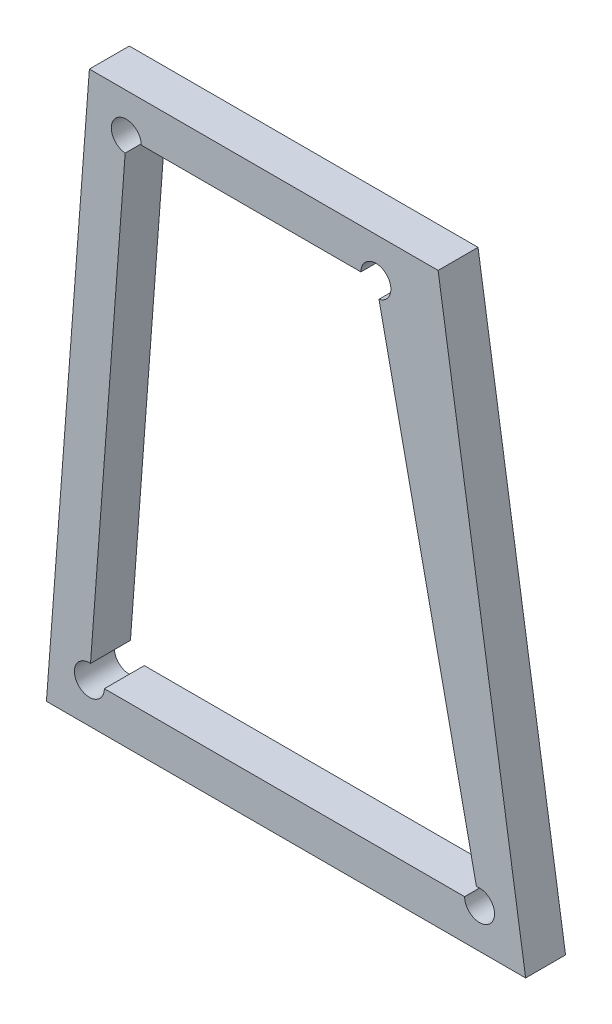
ISO-10303-21;
HEADER;
FILE_DESCRIPTION(('STEP AP214'),'2;1');
FILE_NAME('part.step','',(''),(''),'','','');
FILE_SCHEMA(('AUTOMOTIVE_DESIGN { 1 0 10303 214 1 1 1 1 }'));
ENDSEC;
DATA;
#1=APPLICATION_CONTEXT('core data for automotive mechanical design processes');
#2=APPLICATION_PROTOCOL_DEFINITION('international standard','automotive_design',2000,#1);
#3=PRODUCT_CONTEXT('',#1,'mechanical');
#4=PRODUCT('Part','Part','',(#3));
#5=PRODUCT_RELATED_PRODUCT_CATEGORY('part','',(#4));
#6=PRODUCT_DEFINITION_FORMATION('','',#4);
#7=PRODUCT_DEFINITION_CONTEXT('part definition',#1,'design');
#8=PRODUCT_DEFINITION('design','',#6,#7);
#9=PRODUCT_DEFINITION_SHAPE('','',#8);
#10=(LENGTH_UNIT() NAMED_UNIT(*) SI_UNIT(.MILLI.,.METRE.));
#11=(NAMED_UNIT(*) PLANE_ANGLE_UNIT() SI_UNIT($,.RADIAN.));
#12=(NAMED_UNIT(*) SI_UNIT($,.STERADIAN.) SOLID_ANGLE_UNIT());
#13=UNCERTAINTY_MEASURE_WITH_UNIT(LENGTH_MEASURE(1.E-05),#10,'distance_accuracy_value','');
#14=(GEOMETRIC_REPRESENTATION_CONTEXT(3) GLOBAL_UNCERTAINTY_ASSIGNED_CONTEXT((#13)) GLOBAL_UNIT_ASSIGNED_CONTEXT((#10,
#11,#12)) REPRESENTATION_CONTEXT('',''));
#15=CARTESIAN_POINT('',(0.,0.,0.));
#16=DIRECTION('',(0.,0.,1.));
#17=DIRECTION('',(1.,0.,0.));
#18=AXIS2_PLACEMENT_3D('',#15,#16,#17);
#19=CARTESIAN_POINT('',(0.,0.,4.));
#20=DIRECTION('',(0.,0.,1.));
#21=DIRECTION('',(1.,0.,0.));
#22=AXIS2_PLACEMENT_3D('',#19,#20,#21);
#23=PLANE('',#22);
#24=DIRECTION('',(-0.0752576694706878,-0.997164120486613,0.));
#25=VECTOR('',#24,1.);
#26=CARTESIAN_POINT('',(4.30188679245283,57.,4.));
#27=LINE('',#26,#25);
#28=CARTESIAN_POINT('',(4.30188679245283,57.,4.));
#29=VERTEX_POINT('',#28);
#30=CARTESIAN_POINT('',(0.,0.,4.));
#31=VERTEX_POINT('',#30);
#32=EDGE_CURVE('E189',#29,#31,#27,.T.);
#33=ORIENTED_EDGE('',*,*,#32,.T.);
#34=DIRECTION('',(1.,0.,0.));
#35=VECTOR('',#34,1.);
#36=CARTESIAN_POINT('',(0.,0.,4.));
#37=LINE('',#36,#35);
#38=CARTESIAN_POINT('',(48.,0.,4.));
#39=VERTEX_POINT('',#38);
#40=EDGE_CURVE('E192',#31,#39,#37,.T.);
#41=ORIENTED_EDGE('',*,*,#40,.T.);
#42=DIRECTION('',(-0.152038253867952,0.988374609832114,0.));
#43=VECTOR('',#42,1.);
#44=CARTESIAN_POINT('',(39.2318867924528,57.,4.));
#45=LINE('',#44,#43);
#46=CARTESIAN_POINT('',(39.2318867924528,57.,4.));
#47=VERTEX_POINT('',#46);
#48=EDGE_CURVE('E195',#39,#47,#45,.T.);
#49=ORIENTED_EDGE('',*,*,#48,.T.);
#50=DIRECTION('',(-1.,0.,0.));
#51=VECTOR('',#50,1.);
#52=CARTESIAN_POINT('',(4.30188679245283,57.,4.));
#53=LINE('',#52,#51);
#54=EDGE_CURVE('E197',#47,#29,#53,.T.);
#55=ORIENTED_EDGE('',*,*,#54,.T.);
#56=EDGE_LOOP('',(#33,#41,#49,#55));
#57=FACE_BOUND('',#56,.T.);
#58=DIRECTION('',(1.,0.,0.));
#59=VECTOR('',#58,1.);
#60=CARTESIAN_POINT('',(41.8846938099967,3.99999999999999,4.));
#61=LINE('',#60,#59);
#62=CARTESIAN_POINT('',(5.80188679245283,3.99999999999999,4.));
#63=VERTEX_POINT('',#62);
#64=CARTESIAN_POINT('',(41.8846938099967,3.99999999999999,4.));
#65=VERTEX_POINT('',#64);
#66=EDGE_CURVE('E132',#63,#65,#61,.T.);
#67=ORIENTED_EDGE('',*,*,#66,.F.);
#68=CARTESIAN_POINT('',(4.30188679245283,3.99999999999999,4.));
#69=DIRECTION('',(0.,0.,1.));
#70=DIRECTION('',(1.,0.,0.));
#71=AXIS2_PLACEMENT_3D('',#68,#69,#70);
#72=CIRCLE('',#71,1.5);
#73=CARTESIAN_POINT('',(4.41477329665886,5.49574618072992,4.));
#74=VERTEX_POINT('',#73);
#75=EDGE_CURVE('E124',#74,#63,#72,.T.);
#76=ORIENTED_EDGE('',*,*,#75,.F.);
#77=DIRECTION('',(-0.0752576694706878,-0.997164120486613,0.));
#78=VECTOR('',#77,1.);
#79=CARTESIAN_POINT('',(4.41477329665886,5.49574618072992,4.));
#80=LINE('',#79,#78);
#81=CARTESIAN_POINT('',(7.88711349579397,51.5042538192701,4.));
#82=VERTEX_POINT('',#81);
#83=EDGE_CURVE('E157',#82,#74,#80,.T.);
#84=ORIENTED_EDGE('',*,*,#83,.F.);
#85=CARTESIAN_POINT('',(8.,53.,4.));
#86=DIRECTION('',(0.,0.,1.));
#87=DIRECTION('',(1.,0.,0.));
#88=AXIS2_PLACEMENT_3D('',#85,#86,#87);
#89=CIRCLE('',#88,1.5);
#90=CARTESIAN_POINT('',(9.5,53.,4.));
#91=VERTEX_POINT('',#90);
#92=EDGE_CURVE('E155',#91,#82,#89,.T.);
#93=ORIENTED_EDGE('',*,*,#92,.F.);
#94=DIRECTION('',(-1.,0.,0.));
#95=VECTOR('',#94,1.);
#96=CARTESIAN_POINT('',(9.5,53.,4.));
#97=LINE('',#96,#95);
#98=CARTESIAN_POINT('',(31.5,53.,4.));
#99=VERTEX_POINT('',#98);
#100=EDGE_CURVE('E153',#99,#91,#97,.T.);
#101=ORIENTED_EDGE('',*,*,#100,.F.);
#102=CARTESIAN_POINT('',(33.,53.,4.));
#103=DIRECTION('',(0.,0.,1.));
#104=DIRECTION('',(1.,0.,0.));
#105=AXIS2_PLACEMENT_3D('',#102,#103,#104);
#106=CIRCLE('',#105,1.5);
#107=CARTESIAN_POINT('',(33.3109913509581,51.5325926333736,4.));
#108=VERTEX_POINT('',#107);
#109=EDGE_CURVE('E151',#108,#99,#106,.T.);
#110=ORIENTED_EDGE('',*,*,#109,.F.);
#111=DIRECTION('',(-0.207327567305416,0.978271577750891,0.));
#112=VECTOR('',#111,1.);
#113=CARTESIAN_POINT('',(43.0737024590386,5.46740736662634,4.));
#114=LINE('',#113,#112);
#115=CARTESIAN_POINT('',(43.0737024590386,5.46740736662634,4.));
#116=VERTEX_POINT('',#115);
#117=EDGE_CURVE('E147',#116,#108,#114,.T.);
#118=ORIENTED_EDGE('',*,*,#117,.F.);
#119=CARTESIAN_POINT('',(43.3846938099967,3.99999999999999,4.));
#120=DIRECTION('',(0.,0.,1.));
#121=DIRECTION('',(1.,0.,0.));
#122=AXIS2_PLACEMENT_3D('',#119,#120,#121);
#123=CIRCLE('',#122,1.5);
#124=EDGE_CURVE('E145',#65,#116,#123,.T.);
#125=ORIENTED_EDGE('',*,*,#124,.F.);
#126=EDGE_LOOP('',(#67,#76,#84,#93,#101,#110,#118,#125));
#127=FACE_BOUND('',#126,.T.);
#128=ADVANCED_FACE('F35',(#57,#127),#23,.T.);
#129=CARTESIAN_POINT('',(0.,0.,0.));
#130=DIRECTION('',(0.,0.,1.));
#131=DIRECTION('',(1.,0.,0.));
#132=AXIS2_PLACEMENT_3D('',#129,#130,#131);
#133=PLANE('',#132);
#134=DIRECTION('',(-0.0752576694706878,-0.997164120486613,0.));
#135=VECTOR('',#134,1.);
#136=CARTESIAN_POINT('',(4.30188679245283,57.,0.));
#137=LINE('',#136,#135);
#138=CARTESIAN_POINT('',(4.30188679245283,57.,0.));
#139=VERTEX_POINT('',#138);
#140=CARTESIAN_POINT('',(0.,0.,0.));
#141=VERTEX_POINT('',#140);
#142=EDGE_CURVE('E140',#139,#141,#137,.T.);
#143=ORIENTED_EDGE('',*,*,#142,.F.);
#144=DIRECTION('',(-1.,0.,0.));
#145=VECTOR('',#144,1.);
#146=CARTESIAN_POINT('',(4.30188679245283,57.,0.));
#147=LINE('',#146,#145);
#148=CARTESIAN_POINT('',(39.2318867924528,57.,0.));
#149=VERTEX_POINT('',#148);
#150=EDGE_CURVE('E193',#149,#139,#147,.T.);
#151=ORIENTED_EDGE('',*,*,#150,.F.);
#152=DIRECTION('',(-0.152038253867952,0.988374609832114,0.));
#153=VECTOR('',#152,1.);
#154=CARTESIAN_POINT('',(39.2318867924528,57.,0.));
#155=LINE('',#154,#153);
#156=CARTESIAN_POINT('',(48.,0.,0.));
#157=VERTEX_POINT('',#156);
#158=EDGE_CURVE('E204',#157,#149,#155,.T.);
#159=ORIENTED_EDGE('',*,*,#158,.F.);
#160=DIRECTION('',(1.,0.,0.));
#161=VECTOR('',#160,1.);
#162=CARTESIAN_POINT('',(0.,0.,0.));
#163=LINE('',#162,#161);
#164=EDGE_CURVE('E202',#141,#157,#163,.T.);
#165=ORIENTED_EDGE('',*,*,#164,.F.);
#166=EDGE_LOOP('',(#143,#151,#159,#165));
#167=FACE_BOUND('',#166,.T.);
#168=CARTESIAN_POINT('',(4.30188679245283,3.99999999999999,0.));
#169=DIRECTION('',(0.,0.,1.));
#170=DIRECTION('',(1.,0.,0.));
#171=AXIS2_PLACEMENT_3D('',#168,#169,#170);
#172=CIRCLE('',#171,1.5);
#173=CARTESIAN_POINT('',(4.41477329665886,5.49574618072992,0.));
#174=VERTEX_POINT('',#173);
#175=CARTESIAN_POINT('',(5.80188679245283,3.99999999999999,0.));
#176=VERTEX_POINT('',#175);
#177=EDGE_CURVE('E58',#174,#176,#172,.T.);
#178=ORIENTED_EDGE('',*,*,#177,.T.);
#179=DIRECTION('',(1.,0.,0.));
#180=VECTOR('',#179,1.);
#181=CARTESIAN_POINT('',(41.8846938099967,3.99999999999999,0.));
#182=LINE('',#181,#180);
#183=CARTESIAN_POINT('',(41.8846938099967,3.99999999999999,0.));
#184=VERTEX_POINT('',#183);
#185=EDGE_CURVE('E139',#176,#184,#182,.T.);
#186=ORIENTED_EDGE('',*,*,#185,.T.);
#187=CARTESIAN_POINT('',(43.3846938099967,3.99999999999999,0.));
#188=DIRECTION('',(0.,0.,1.));
#189=DIRECTION('',(1.,0.,0.));
#190=AXIS2_PLACEMENT_3D('',#187,#188,#189);
#191=CIRCLE('',#190,1.5);
#192=CARTESIAN_POINT('',(43.0737024590386,5.46740736662634,0.));
#193=VERTEX_POINT('',#192);
#194=EDGE_CURVE('E161',#184,#193,#191,.T.);
#195=ORIENTED_EDGE('',*,*,#194,.T.);
#196=DIRECTION('',(-0.207327567305416,0.978271577750891,0.));
#197=VECTOR('',#196,1.);
#198=CARTESIAN_POINT('',(43.0737024590386,5.46740736662634,0.));
#199=LINE('',#198,#197);
#200=CARTESIAN_POINT('',(33.3109913509581,51.5325926333736,0.));
#201=VERTEX_POINT('',#200);
#202=EDGE_CURVE('E164',#193,#201,#199,.T.);
#203=ORIENTED_EDGE('',*,*,#202,.T.);
#204=CARTESIAN_POINT('',(33.,53.,0.));
#205=DIRECTION('',(0.,0.,1.));
#206=DIRECTION('',(1.,0.,0.));
#207=AXIS2_PLACEMENT_3D('',#204,#205,#206);
#208=CIRCLE('',#207,1.5);
#209=CARTESIAN_POINT('',(31.5,53.,0.));
#210=VERTEX_POINT('',#209);
#211=EDGE_CURVE('E167',#201,#210,#208,.T.);
#212=ORIENTED_EDGE('',*,*,#211,.T.);
#213=DIRECTION('',(-1.,0.,0.));
#214=VECTOR('',#213,1.);
#215=CARTESIAN_POINT('',(9.5,53.,0.));
#216=LINE('',#215,#214);
#217=CARTESIAN_POINT('',(9.5,53.,0.));
#218=VERTEX_POINT('',#217);
#219=EDGE_CURVE('E170',#210,#218,#216,.T.);
#220=ORIENTED_EDGE('',*,*,#219,.T.);
#221=CARTESIAN_POINT('',(8.,53.,0.));
#222=DIRECTION('',(0.,0.,1.));
#223=DIRECTION('',(1.,0.,0.));
#224=AXIS2_PLACEMENT_3D('',#221,#222,#223);
#225=CIRCLE('',#224,1.5);
#226=CARTESIAN_POINT('',(7.88711349579397,51.5042538192701,0.));
#227=VERTEX_POINT('',#226);
#228=EDGE_CURVE('E173',#218,#227,#225,.T.);
#229=ORIENTED_EDGE('',*,*,#228,.T.);
#230=DIRECTION('',(-0.0752576694706878,-0.997164120486613,0.));
#231=VECTOR('',#230,1.);
#232=CARTESIAN_POINT('',(4.41477329665886,5.49574618072992,0.));
#233=LINE('',#232,#231);
#234=EDGE_CURVE('E133',#227,#174,#233,.T.);
#235=ORIENTED_EDGE('',*,*,#234,.T.);
#236=EDGE_LOOP('',(#178,#186,#195,#203,#212,#220,#229,#235));
#237=FACE_BOUND('',#236,.T.);
#238=ADVANCED_FACE('F222',(#167,#237),#133,.F.);
#239=CARTESIAN_POINT('',(4.30188679245283,57.,4.));
#240=DIRECTION('',(0.997164120486613,-0.0752576694706878,0.));
#241=DIRECTION('',(0.0752576694706878,0.997164120486613,0.));
#242=AXIS2_PLACEMENT_3D('',#239,#240,#241);
#243=PLANE('',#242);
#244=ORIENTED_EDGE('',*,*,#142,.T.);
#245=DIRECTION('',(0.,0.,-1.));
#246=VECTOR('',#245,1.);
#247=CARTESIAN_POINT('',(0.,0.,4.));
#248=LINE('',#247,#246);
#249=EDGE_CURVE('E11',#31,#141,#248,.T.);
#250=ORIENTED_EDGE('',*,*,#249,.F.);
#251=ORIENTED_EDGE('',*,*,#32,.F.);
#252=DIRECTION('',(0.,0.,-1.));
#253=VECTOR('',#252,1.);
#254=CARTESIAN_POINT('',(4.30188679245283,57.,4.));
#255=LINE('',#254,#253);
#256=EDGE_CURVE('E199',#29,#139,#255,.T.);
#257=ORIENTED_EDGE('',*,*,#256,.T.);
#258=EDGE_LOOP('',(#244,#250,#251,#257));
#259=FACE_BOUND('',#258,.T.);
#260=ADVANCED_FACE('F37',(#259),#243,.F.);
#261=CARTESIAN_POINT('',(0.,0.,4.));
#262=DIRECTION('',(0.,1.,0.));
#263=DIRECTION('',(0.,0.,1.));
#264=AXIS2_PLACEMENT_3D('',#261,#262,#263);
#265=PLANE('',#264);
#266=ORIENTED_EDGE('',*,*,#164,.T.);
#267=DIRECTION('',(0.,0.,-1.));
#268=VECTOR('',#267,1.);
#269=CARTESIAN_POINT('',(48.,0.,4.));
#270=LINE('',#269,#268);
#271=EDGE_CURVE('E43',#39,#157,#270,.T.);
#272=ORIENTED_EDGE('',*,*,#271,.F.);
#273=ORIENTED_EDGE('',*,*,#40,.F.);
#274=ORIENTED_EDGE('',*,*,#249,.T.);
#275=EDGE_LOOP('',(#266,#272,#273,#274));
#276=FACE_BOUND('',#275,.T.);
#277=ADVANCED_FACE('F232',(#276),#265,.F.);
#278=CARTESIAN_POINT('',(39.2318867924528,57.,4.));
#279=DIRECTION('',(-0.988374609832114,-0.152038253867952,0.));
#280=DIRECTION('',(0.152038253867952,-0.988374609832114,0.));
#281=AXIS2_PLACEMENT_3D('',#278,#279,#280);
#282=PLANE('',#281);
#283=ORIENTED_EDGE('',*,*,#158,.T.);
#284=DIRECTION('',(0.,0.,-1.));
#285=VECTOR('',#284,1.);
#286=CARTESIAN_POINT('',(39.2318867924528,57.,4.));
#287=LINE('',#286,#285);
#288=EDGE_CURVE('E209',#47,#149,#287,.T.);
#289=ORIENTED_EDGE('',*,*,#288,.F.);
#290=ORIENTED_EDGE('',*,*,#48,.F.);
#291=ORIENTED_EDGE('',*,*,#271,.T.);
#292=EDGE_LOOP('',(#283,#289,#290,#291));
#293=FACE_BOUND('',#292,.T.);
#294=ADVANCED_FACE('F216',(#293),#282,.F.);
#295=CARTESIAN_POINT('',(4.30188679245283,57.,4.));
#296=DIRECTION('',(0.,-1.,0.));
#297=DIRECTION('',(0.,0.,-1.));
#298=AXIS2_PLACEMENT_3D('',#295,#296,#297);
#299=PLANE('',#298);
#300=ORIENTED_EDGE('',*,*,#150,.T.);
#301=ORIENTED_EDGE('',*,*,#256,.F.);
#302=ORIENTED_EDGE('',*,*,#54,.F.);
#303=ORIENTED_EDGE('',*,*,#288,.T.);
#304=EDGE_LOOP('',(#300,#301,#302,#303));
#305=FACE_BOUND('',#304,.T.);
#306=ADVANCED_FACE('F226',(#305),#299,.F.);
#307=CARTESIAN_POINT('',(4.30188679245283,3.99999999999999,4.));
#308=DIRECTION('',(0.,0.,-1.));
#309=DIRECTION('',(-1.,0.,0.));
#310=AXIS2_PLACEMENT_3D('',#307,#308,#309);
#311=CYLINDRICAL_SURFACE('',#310,1.5);
#312=ORIENTED_EDGE('',*,*,#177,.F.);
#313=DIRECTION('',(0.,0.,-1.));
#314=VECTOR('',#313,1.);
#315=CARTESIAN_POINT('',(4.41477329665886,5.49574618072992,4.));
#316=LINE('',#315,#314);
#317=EDGE_CURVE('E128',#74,#174,#316,.T.);
#318=ORIENTED_EDGE('',*,*,#317,.F.);
#319=ORIENTED_EDGE('',*,*,#75,.T.);
#320=DIRECTION('',(0.,0.,-1.));
#321=VECTOR('',#320,1.);
#322=CARTESIAN_POINT('',(5.80188679245283,3.99999999999999,4.));
#323=LINE('',#322,#321);
#324=EDGE_CURVE('E127',#63,#176,#323,.T.);
#325=ORIENTED_EDGE('',*,*,#324,.T.);
#326=EDGE_LOOP('',(#312,#318,#319,#325));
#327=FACE_BOUND('',#326,.T.);
#328=ADVANCED_FACE('F126',(#327),#311,.F.);
#329=CARTESIAN_POINT('',(41.8846938099967,3.99999999999999,4.));
#330=DIRECTION('',(0.,1.,0.));
#331=DIRECTION('',(0.,0.,1.));
#332=AXIS2_PLACEMENT_3D('',#329,#330,#331);
#333=PLANE('',#332);
#334=ORIENTED_EDGE('',*,*,#185,.F.);
#335=ORIENTED_EDGE('',*,*,#324,.F.);
#336=ORIENTED_EDGE('',*,*,#66,.T.);
#337=DIRECTION('',(0.,0.,-1.));
#338=VECTOR('',#337,1.);
#339=CARTESIAN_POINT('',(41.8846938099967,3.99999999999999,4.));
#340=LINE('',#339,#338);
#341=EDGE_CURVE('E141',#65,#184,#340,.T.);
#342=ORIENTED_EDGE('',*,*,#341,.T.);
#343=EDGE_LOOP('',(#334,#335,#336,#342));
#344=FACE_BOUND('',#343,.T.);
#345=ADVANCED_FACE('F136',(#344),#333,.T.);
#346=CARTESIAN_POINT('',(43.3846938099967,3.99999999999999,4.));
#347=DIRECTION('',(0.,0.,-1.));
#348=DIRECTION('',(-1.,0.,0.));
#349=AXIS2_PLACEMENT_3D('',#346,#347,#348);
#350=CYLINDRICAL_SURFACE('',#349,1.5);
#351=ORIENTED_EDGE('',*,*,#194,.F.);
#352=ORIENTED_EDGE('',*,*,#341,.F.);
#353=ORIENTED_EDGE('',*,*,#124,.T.);
#354=DIRECTION('',(0.,0.,-1.));
#355=VECTOR('',#354,1.);
#356=CARTESIAN_POINT('',(43.0737024590386,5.46740736662634,4.));
#357=LINE('',#356,#355);
#358=EDGE_CURVE('E186',#116,#193,#357,.T.);
#359=ORIENTED_EDGE('',*,*,#358,.T.);
#360=EDGE_LOOP('',(#351,#352,#353,#359));
#361=FACE_BOUND('',#360,.T.);
#362=ADVANCED_FACE('F255',(#361),#350,.F.);
#363=CARTESIAN_POINT('',(43.0737024590386,5.46740736662634,4.));
#364=DIRECTION('',(-0.978271577750891,-0.207327567305416,0.));
#365=DIRECTION('',(0.207327567305416,-0.978271577750891,0.));
#366=AXIS2_PLACEMENT_3D('',#363,#364,#365);
#367=PLANE('',#366);
#368=ORIENTED_EDGE('',*,*,#202,.F.);
#369=ORIENTED_EDGE('',*,*,#358,.F.);
#370=ORIENTED_EDGE('',*,*,#117,.T.);
#371=DIRECTION('',(0.,0.,-1.));
#372=VECTOR('',#371,1.);
#373=CARTESIAN_POINT('',(33.3109913509581,51.5325926333736,4.));
#374=LINE('',#373,#372);
#375=EDGE_CURVE('E184',#108,#201,#374,.T.);
#376=ORIENTED_EDGE('',*,*,#375,.T.);
#377=EDGE_LOOP('',(#368,#369,#370,#376));
#378=FACE_BOUND('',#377,.T.);
#379=ADVANCED_FACE('F259',(#378),#367,.T.);
#380=CARTESIAN_POINT('',(33.,53.,4.));
#381=DIRECTION('',(0.,0.,-1.));
#382=DIRECTION('',(-1.,0.,0.));
#383=AXIS2_PLACEMENT_3D('',#380,#381,#382);
#384=CYLINDRICAL_SURFACE('',#383,1.5);
#385=ORIENTED_EDGE('',*,*,#211,.F.);
#386=ORIENTED_EDGE('',*,*,#375,.F.);
#387=ORIENTED_EDGE('',*,*,#109,.T.);
#388=DIRECTION('',(0.,0.,-1.));
#389=VECTOR('',#388,1.);
#390=CARTESIAN_POINT('',(31.5,53.,4.));
#391=LINE('',#390,#389);
#392=EDGE_CURVE('E182',#99,#210,#391,.T.);
#393=ORIENTED_EDGE('',*,*,#392,.T.);
#394=EDGE_LOOP('',(#385,#386,#387,#393));
#395=FACE_BOUND('',#394,.T.);
#396=ADVANCED_FACE('F265',(#395),#384,.F.);
#397=CARTESIAN_POINT('',(9.5,53.,4.));
#398=DIRECTION('',(0.,-1.,0.));
#399=DIRECTION('',(0.,0.,-1.));
#400=AXIS2_PLACEMENT_3D('',#397,#398,#399);
#401=PLANE('',#400);
#402=ORIENTED_EDGE('',*,*,#219,.F.);
#403=ORIENTED_EDGE('',*,*,#392,.F.);
#404=ORIENTED_EDGE('',*,*,#100,.T.);
#405=DIRECTION('',(0.,0.,-1.));
#406=VECTOR('',#405,1.);
#407=CARTESIAN_POINT('',(9.5,53.,4.));
#408=LINE('',#407,#406);
#409=EDGE_CURVE('E180',#91,#218,#408,.T.);
#410=ORIENTED_EDGE('',*,*,#409,.T.);
#411=EDGE_LOOP('',(#402,#403,#404,#410));
#412=FACE_BOUND('',#411,.T.);
#413=ADVANCED_FACE('F269',(#412),#401,.T.);
#414=CARTESIAN_POINT('',(8.,53.,4.));
#415=DIRECTION('',(0.,0.,-1.));
#416=DIRECTION('',(-1.,0.,0.));
#417=AXIS2_PLACEMENT_3D('',#414,#415,#416);
#418=CYLINDRICAL_SURFACE('',#417,1.5);
#419=ORIENTED_EDGE('',*,*,#228,.F.);
#420=ORIENTED_EDGE('',*,*,#409,.F.);
#421=ORIENTED_EDGE('',*,*,#92,.T.);
#422=DIRECTION('',(0.,0.,-1.));
#423=VECTOR('',#422,1.);
#424=CARTESIAN_POINT('',(7.88711349579397,51.5042538192701,4.));
#425=LINE('',#424,#423);
#426=EDGE_CURVE('E50',#82,#227,#425,.T.);
#427=ORIENTED_EDGE('',*,*,#426,.T.);
#428=EDGE_LOOP('',(#419,#420,#421,#427));
#429=FACE_BOUND('',#428,.T.);
#430=ADVANCED_FACE('F273',(#429),#418,.F.);
#431=CARTESIAN_POINT('',(4.41477329665886,5.49574618072992,4.));
#432=DIRECTION('',(0.997164120486613,-0.0752576694706878,0.));
#433=DIRECTION('',(0.0752576694706878,0.997164120486613,0.));
#434=AXIS2_PLACEMENT_3D('',#431,#432,#433);
#435=PLANE('',#434);
#436=ORIENTED_EDGE('',*,*,#234,.F.);
#437=ORIENTED_EDGE('',*,*,#426,.F.);
#438=ORIENTED_EDGE('',*,*,#83,.T.);
#439=ORIENTED_EDGE('',*,*,#317,.T.);
#440=EDGE_LOOP('',(#436,#437,#438,#439));
#441=FACE_BOUND('',#440,.T.);
#442=ADVANCED_FACE('F277',(#441),#435,.T.);
#443=CLOSED_SHELL('',(#128,#238,#260,#277,#294,#306,#328,#345,#362,#379,#396,#413,#430,#442));
#444=MANIFOLD_SOLID_BREP('B2',#443);
#445=ADVANCED_BREP_SHAPE_REPRESENTATION('',(#18,#444),#14);
#446=SHAPE_DEFINITION_REPRESENTATION(#9,#445);
ENDSEC;
END-ISO-10303-21;
